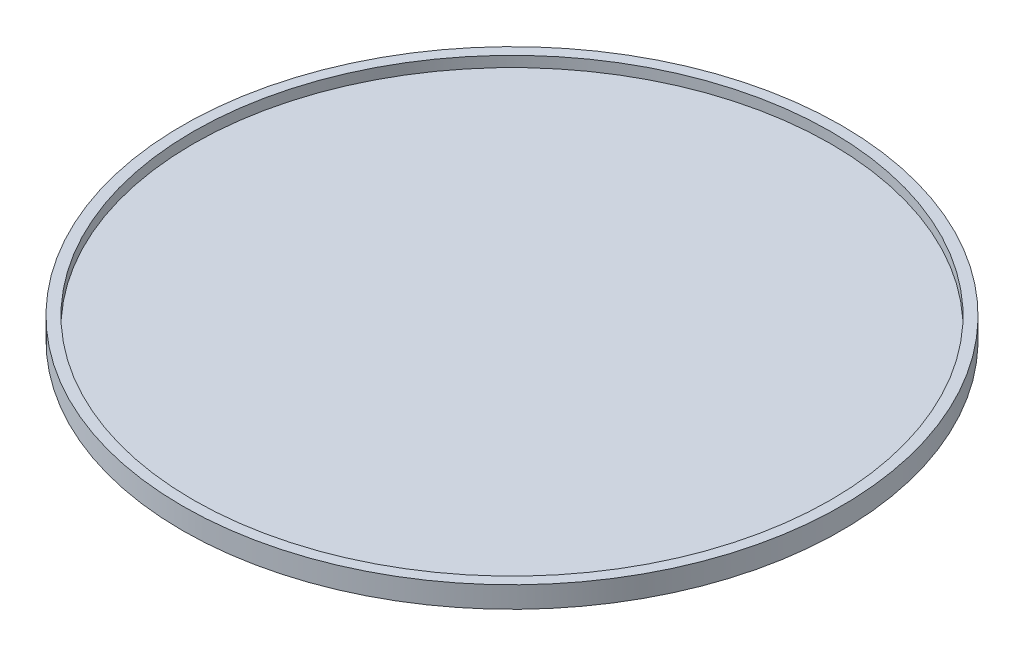
ISO-10303-21;
HEADER;
FILE_DESCRIPTION(('STEP AP214'),'2;1');
FILE_NAME('part.step','',(''),(''),'','','');
FILE_SCHEMA(('AUTOMOTIVE_DESIGN { 1 0 10303 214 1 1 1 1 }'));
ENDSEC;
DATA;
#1=APPLICATION_CONTEXT('core data for automotive mechanical design processes');
#2=APPLICATION_PROTOCOL_DEFINITION('international standard','automotive_design',2000,#1);
#3=PRODUCT_CONTEXT('',#1,'mechanical');
#4=PRODUCT('Part','Part','',(#3));
#5=PRODUCT_RELATED_PRODUCT_CATEGORY('part','',(#4));
#6=PRODUCT_DEFINITION_FORMATION('','',#4);
#7=PRODUCT_DEFINITION_CONTEXT('part definition',#1,'design');
#8=PRODUCT_DEFINITION('design','',#6,#7);
#9=PRODUCT_DEFINITION_SHAPE('','',#8);
#10=(LENGTH_UNIT() NAMED_UNIT(*) SI_UNIT(.MILLI.,.METRE.));
#11=(NAMED_UNIT(*) PLANE_ANGLE_UNIT() SI_UNIT($,.RADIAN.));
#12=(NAMED_UNIT(*) SI_UNIT($,.STERADIAN.) SOLID_ANGLE_UNIT());
#13=UNCERTAINTY_MEASURE_WITH_UNIT(LENGTH_MEASURE(1.E-05),#10,'distance_accuracy_value','');
#14=(GEOMETRIC_REPRESENTATION_CONTEXT(3) GLOBAL_UNCERTAINTY_ASSIGNED_CONTEXT((#13)) GLOBAL_UNIT_ASSIGNED_CONTEXT((#10,
#11,#12)) REPRESENTATION_CONTEXT('',''));
#15=CARTESIAN_POINT('',(0.,0.,0.));
#16=DIRECTION('',(0.,0.,1.));
#17=DIRECTION('',(1.,0.,0.));
#18=AXIS2_PLACEMENT_3D('',#15,#16,#17);
#19=CARTESIAN_POINT('',(0.,5.,0.));
#20=DIRECTION('',(0.,-1.,0.));
#21=DIRECTION('',(0.,0.,-1.));
#22=AXIS2_PLACEMENT_3D('',#19,#20,#21);
#23=CYLINDRICAL_SURFACE('',#22,155.);
#24=CARTESIAN_POINT('',(0.,0.,0.));
#25=DIRECTION('',(0.,1.,0.));
#26=DIRECTION('',(0.,0.,1.));
#27=AXIS2_PLACEMENT_3D('',#24,#25,#26);
#28=CIRCLE('',#27,155.);
#29=CARTESIAN_POINT('',(0.,0.,155.));
#30=VERTEX_POINT('',#29);
#31=EDGE_CURVE('E44',#30,#30,#28,.T.);
#32=ORIENTED_EDGE('',*,*,#31,.T.);
#33=EDGE_LOOP('',(#32));
#34=FACE_BOUND('',#33,.T.);
#35=CARTESIAN_POINT('',(0.,10.,0.));
#36=DIRECTION('',(0.,1.,0.));
#37=DIRECTION('',(0.,0.,1.));
#38=AXIS2_PLACEMENT_3D('',#35,#36,#37);
#39=CIRCLE('',#38,155.);
#40=CARTESIAN_POINT('',(0.,10.,155.));
#41=VERTEX_POINT('',#40);
#42=EDGE_CURVE('E49',#41,#41,#39,.T.);
#43=ORIENTED_EDGE('',*,*,#42,.F.);
#44=EDGE_LOOP('',(#43));
#45=FACE_BOUND('',#44,.T.);
#46=ADVANCED_FACE('F37',(#34,#45),#23,.T.);
#47=CARTESIAN_POINT('',(0.,0.,0.));
#48=DIRECTION('',(0.,1.,0.));
#49=DIRECTION('',(0.,0.,1.));
#50=AXIS2_PLACEMENT_3D('',#47,#48,#49);
#51=PLANE('',#50);
#52=ORIENTED_EDGE('',*,*,#31,.F.);
#53=EDGE_LOOP('',(#52));
#54=FACE_BOUND('',#53,.T.);
#55=ADVANCED_FACE('F65',(#54),#51,.F.);
#56=CARTESIAN_POINT('',(0.,10.,0.));
#57=DIRECTION('',(0.,1.,0.));
#58=DIRECTION('',(0.,0.,1.));
#59=AXIS2_PLACEMENT_3D('',#56,#57,#58);
#60=PLANE('',#59);
#61=ORIENTED_EDGE('',*,*,#42,.T.);
#62=EDGE_LOOP('',(#61));
#63=FACE_BOUND('',#62,.T.);
#64=CARTESIAN_POINT('',(0.,10.,0.));
#65=DIRECTION('',(0.,1.,0.));
#66=DIRECTION('',(0.,0.,1.));
#67=AXIS2_PLACEMENT_3D('',#64,#65,#66);
#68=CIRCLE('',#67,150.);
#69=CARTESIAN_POINT('',(0.,10.,150.));
#70=VERTEX_POINT('',#69);
#71=EDGE_CURVE('E54',#70,#70,#68,.T.);
#72=ORIENTED_EDGE('',*,*,#71,.F.);
#73=EDGE_LOOP('',(#72));
#74=FACE_BOUND('',#73,.T.);
#75=ADVANCED_FACE('F63',(#63,#74),#60,.T.);
#76=CARTESIAN_POINT('',(0.,10.,0.));
#77=DIRECTION('',(0.,-1.,0.));
#78=DIRECTION('',(0.,0.,-1.));
#79=AXIS2_PLACEMENT_3D('',#76,#77,#78);
#80=CYLINDRICAL_SURFACE('',#79,150.);
#81=ORIENTED_EDGE('',*,*,#71,.T.);
#82=EDGE_LOOP('',(#81));
#83=FACE_BOUND('',#82,.T.);
#84=CARTESIAN_POINT('',(0.,5.,0.));
#85=DIRECTION('',(0.,1.,0.));
#86=DIRECTION('',(0.,0.,1.));
#87=AXIS2_PLACEMENT_3D('',#84,#85,#86);
#88=CIRCLE('',#87,150.);
#89=CARTESIAN_POINT('',(0.,5.,150.));
#90=VERTEX_POINT('',#89);
#91=EDGE_CURVE('E10',#90,#90,#88,.F.);
#92=ORIENTED_EDGE('',*,*,#91,.T.);
#93=EDGE_LOOP('',(#92));
#94=FACE_BOUND('',#93,.T.);
#95=ADVANCED_FACE('F61',(#83,#94),#80,.F.);
#96=CARTESIAN_POINT('',(0.,5.,0.));
#97=DIRECTION('',(0.,1.,0.));
#98=DIRECTION('',(0.,0.,1.));
#99=AXIS2_PLACEMENT_3D('',#96,#97,#98);
#100=PLANE('',#99);
#101=ORIENTED_EDGE('',*,*,#91,.F.);
#102=EDGE_LOOP('',(#101));
#103=FACE_BOUND('',#102,.T.);
#104=ADVANCED_FACE('F72',(#103),#100,.T.);
#105=CLOSED_SHELL('',(#46,#55,#75,#95,#104));
#106=MANIFOLD_SOLID_BREP('B2',#105);
#107=ADVANCED_BREP_SHAPE_REPRESENTATION('',(#18,#106),#14);
#108=SHAPE_DEFINITION_REPRESENTATION(#9,#107);
ENDSEC;
END-ISO-10303-21;
